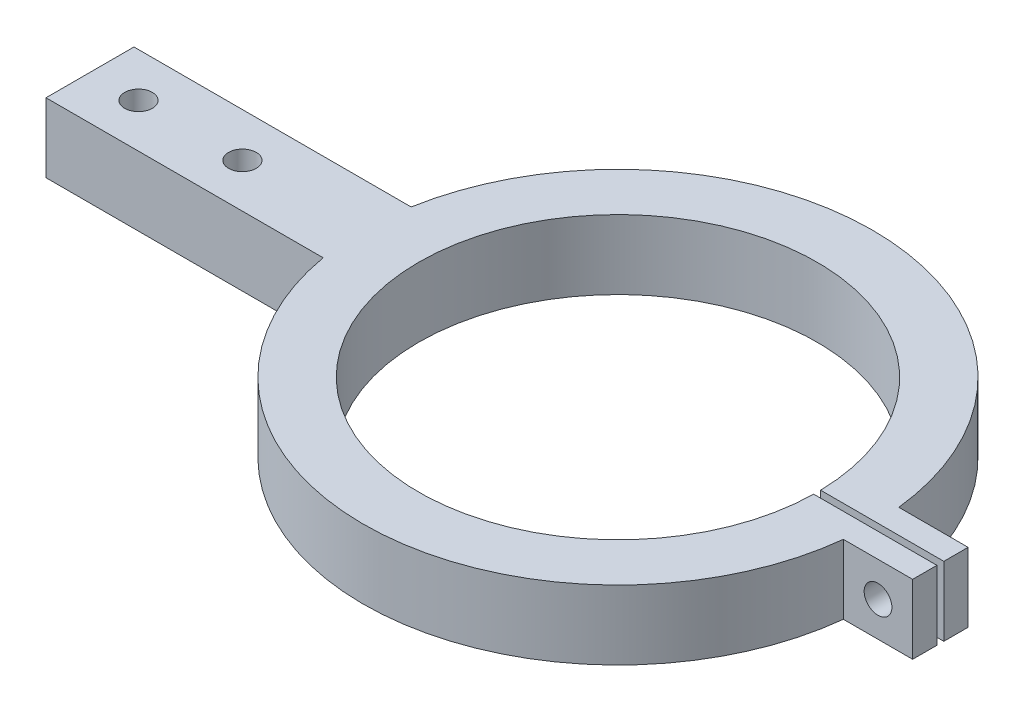
ISO-10303-21;
HEADER;
FILE_DESCRIPTION(('STEP AP214'),'2;1');
FILE_NAME('part.step','',(''),(''),'','','');
FILE_SCHEMA(('AUTOMOTIVE_DESIGN { 1 0 10303 214 1 1 1 1 }'));
ENDSEC;
DATA;
#1=APPLICATION_CONTEXT('core data for automotive mechanical design processes');
#2=APPLICATION_PROTOCOL_DEFINITION('international standard','automotive_design',2000,#1);
#3=PRODUCT_CONTEXT('',#1,'mechanical');
#4=PRODUCT('Part','Part','',(#3));
#5=PRODUCT_RELATED_PRODUCT_CATEGORY('part','',(#4));
#6=PRODUCT_DEFINITION_FORMATION('','',#4);
#7=PRODUCT_DEFINITION_CONTEXT('part definition',#1,'design');
#8=PRODUCT_DEFINITION('design','',#6,#7);
#9=PRODUCT_DEFINITION_SHAPE('','',#8);
#10=(LENGTH_UNIT() NAMED_UNIT(*) SI_UNIT(.MILLI.,.METRE.));
#11=(NAMED_UNIT(*) PLANE_ANGLE_UNIT() SI_UNIT($,.RADIAN.));
#12=(NAMED_UNIT(*) SI_UNIT($,.STERADIAN.) SOLID_ANGLE_UNIT());
#13=UNCERTAINTY_MEASURE_WITH_UNIT(LENGTH_MEASURE(1.E-05),#10,'distance_accuracy_value','');
#14=(GEOMETRIC_REPRESENTATION_CONTEXT(3) GLOBAL_UNCERTAINTY_ASSIGNED_CONTEXT((#13)) GLOBAL_UNIT_ASSIGNED_CONTEXT((#10,
#11,#12)) REPRESENTATION_CONTEXT('',''));
#15=CARTESIAN_POINT('',(0.,0.,0.));
#16=DIRECTION('',(0.,0.,1.));
#17=DIRECTION('',(1.,0.,0.));
#18=AXIS2_PLACEMENT_3D('',#15,#16,#17);
#19=CARTESIAN_POINT('',(0.,10.,0.));
#20=DIRECTION('',(0.,1.,0.));
#21=DIRECTION('',(0.,0.,1.));
#22=AXIS2_PLACEMENT_3D('',#19,#20,#21);
#23=PLANE('',#22);
#24=CARTESIAN_POINT('',(-69.1972374636518,10.,0.));
#25=DIRECTION('',(0.,1.,0.));
#26=DIRECTION('',(0.,0.,1.));
#27=AXIS2_PLACEMENT_3D('',#24,#25,#26);
#28=CIRCLE('',#27,2.);
#29=CARTESIAN_POINT('',(-69.1972374636518,10.,2.));
#30=VERTEX_POINT('',#29);
#31=EDGE_CURVE('E237',#30,#30,#28,.T.);
#32=ORIENTED_EDGE('',*,*,#31,.F.);
#33=EDGE_LOOP('',(#32));
#34=FACE_BOUND('',#33,.T.);
#35=DIRECTION('',(-1.,0.,0.));
#36=VECTOR('',#35,1.);
#37=CARTESIAN_POINT('',(46.5316643475219,10.,-4.));
#38=LINE('',#37,#36);
#39=CARTESIAN_POINT('',(46.5316643475219,10.,-4.));
#40=VERTEX_POINT('',#39);
#41=CARTESIAN_POINT('',(36.5316643475219,10.,-4.));
#42=VERTEX_POINT('',#41);
#43=EDGE_CURVE('E263',#40,#42,#38,.T.);
#44=ORIENTED_EDGE('',*,*,#43,.T.);
#45=CARTESIAN_POINT('',(0.,10.,0.));
#46=DIRECTION('',(0.,1.,0.));
#47=DIRECTION('',(0.,0.,1.));
#48=AXIS2_PLACEMENT_3D('',#45,#46,#47);
#49=CIRCLE('',#48,36.75);
#50=CARTESIAN_POINT('',(-36.1972374636518,10.,-6.34999999999999));
#51=VERTEX_POINT('',#50);
#52=EDGE_CURVE('E182',#42,#51,#49,.T.);
#53=ORIENTED_EDGE('',*,*,#52,.T.);
#54=DIRECTION('',(1.,0.,0.));
#55=VECTOR('',#54,1.);
#56=CARTESIAN_POINT('',(-76.1972374636518,10.,-6.34999999999999));
#57=LINE('',#56,#55);
#58=CARTESIAN_POINT('',(-76.1972374636518,10.,-6.34999999999999));
#59=VERTEX_POINT('',#58);
#60=EDGE_CURVE('E285',#59,#51,#57,.T.);
#61=ORIENTED_EDGE('',*,*,#60,.F.);
#62=DIRECTION('',(0.,0.,-1.));
#63=VECTOR('',#62,1.);
#64=CARTESIAN_POINT('',(-76.1972374636518,10.,6.35000000000001));
#65=LINE('',#64,#63);
#66=CARTESIAN_POINT('',(-76.1972374636518,10.,6.35000000000001));
#67=VERTEX_POINT('',#66);
#68=EDGE_CURVE('E300',#67,#59,#65,.T.);
#69=ORIENTED_EDGE('',*,*,#68,.F.);
#70=DIRECTION('',(1.,0.,0.));
#71=VECTOR('',#70,1.);
#72=CARTESIAN_POINT('',(-76.1972374636518,10.,6.35000000000001));
#73=LINE('',#72,#71);
#74=CARTESIAN_POINT('',(-36.1972374636518,10.,6.35000000000001));
#75=VERTEX_POINT('',#74);
#76=EDGE_CURVE('E302',#67,#75,#73,.T.);
#77=ORIENTED_EDGE('',*,*,#76,.T.);
#78=CARTESIAN_POINT('',(0.,10.,0.));
#79=DIRECTION('',(0.,1.,0.));
#80=DIRECTION('',(0.,0.,1.));
#81=AXIS2_PLACEMENT_3D('',#78,#79,#80);
#82=CIRCLE('',#81,36.75);
#83=CARTESIAN_POINT('',(36.5316643475219,10.,4.00000000000002));
#84=VERTEX_POINT('',#83);
#85=EDGE_CURVE('E308',#75,#84,#82,.T.);
#86=ORIENTED_EDGE('',*,*,#85,.T.);
#87=DIRECTION('',(-1.,0.,0.));
#88=VECTOR('',#87,1.);
#89=CARTESIAN_POINT('',(46.5316643475219,10.,4.));
#90=LINE('',#89,#88);
#91=CARTESIAN_POINT('',(46.5316643475219,10.,4.));
#92=VERTEX_POINT('',#91);
#93=EDGE_CURVE('E310',#92,#84,#90,.T.);
#94=ORIENTED_EDGE('',*,*,#93,.F.);
#95=DIRECTION('',(0.,0.,-1.));
#96=VECTOR('',#95,1.);
#97=CARTESIAN_POINT('',(46.5316643475219,10.,4.));
#98=LINE('',#97,#96);
#99=CARTESIAN_POINT('',(46.5316643475219,10.,0.5));
#100=VERTEX_POINT('',#99);
#101=EDGE_CURVE('E227',#92,#100,#98,.T.);
#102=ORIENTED_EDGE('',*,*,#101,.T.);
#103=DIRECTION('',(1.,0.,0.));
#104=VECTOR('',#103,1.);
#105=CARTESIAN_POINT('',(28.7456518451052,10.,0.5));
#106=LINE('',#105,#104);
#107=CARTESIAN_POINT('',(28.7456518451052,10.,0.5));
#108=VERTEX_POINT('',#107);
#109=EDGE_CURVE('E225',#108,#100,#106,.T.);
#110=ORIENTED_EDGE('',*,*,#109,.F.);
#111=CARTESIAN_POINT('',(0.,10.,0.));
#112=DIRECTION('',(0.,1.,0.));
#113=DIRECTION('',(0.,0.,1.));
#114=AXIS2_PLACEMENT_3D('',#111,#112,#113);
#115=CIRCLE('',#114,28.75);
#116=CARTESIAN_POINT('',(28.7456518451052,10.,-0.500000000000002));
#117=VERTEX_POINT('',#116);
#118=EDGE_CURVE('E213',#117,#108,#115,.T.);
#119=ORIENTED_EDGE('',*,*,#118,.F.);
#120=DIRECTION('',(1.,0.,0.));
#121=VECTOR('',#120,1.);
#122=CARTESIAN_POINT('',(28.7456518451052,10.,-0.5));
#123=LINE('',#122,#121);
#124=CARTESIAN_POINT('',(46.5316643475219,10.,-0.5));
#125=VERTEX_POINT('',#124);
#126=EDGE_CURVE('E219',#117,#125,#123,.T.);
#127=ORIENTED_EDGE('',*,*,#126,.T.);
#128=DIRECTION('',(0.,0.,-1.));
#129=VECTOR('',#128,1.);
#130=CARTESIAN_POINT('',(46.5316643475219,10.,-0.5));
#131=LINE('',#130,#129);
#132=EDGE_CURVE('E128',#125,#40,#131,.T.);
#133=ORIENTED_EDGE('',*,*,#132,.T.);
#134=EDGE_LOOP('',(#44,#53,#61,#69,#77,#86,#94,#102,#110,#119,#127,#133));
#135=FACE_BOUND('',#134,.T.);
#136=CARTESIAN_POINT('',(-54.1972374636518,10.,0.));
#137=DIRECTION('',(0.,1.,0.));
#138=DIRECTION('',(0.,0.,1.));
#139=AXIS2_PLACEMENT_3D('',#136,#137,#138);
#140=CIRCLE('',#139,2.);
#141=CARTESIAN_POINT('',(-54.1972374636518,10.,2.00000000000001));
#142=VERTEX_POINT('',#141);
#143=EDGE_CURVE('E372',#142,#142,#140,.T.);
#144=ORIENTED_EDGE('',*,*,#143,.F.);
#145=EDGE_LOOP('',(#144));
#146=FACE_BOUND('',#145,.T.);
#147=ADVANCED_FACE('F110',(#34,#135,#146),#23,.T.);
#148=CARTESIAN_POINT('',(0.,0.,0.));
#149=DIRECTION('',(0.,1.,0.));
#150=DIRECTION('',(0.,0.,1.));
#151=AXIS2_PLACEMENT_3D('',#148,#149,#150);
#152=PLANE('',#151);
#153=DIRECTION('',(-1.,0.,0.));
#154=VECTOR('',#153,1.);
#155=CARTESIAN_POINT('',(46.5316643475219,0.,-4.));
#156=LINE('',#155,#154);
#157=CARTESIAN_POINT('',(46.5316643475219,0.,-4.));
#158=VERTEX_POINT('',#157);
#159=CARTESIAN_POINT('',(36.5316643475219,0.,-4.));
#160=VERTEX_POINT('',#159);
#161=EDGE_CURVE('E233',#158,#160,#156,.T.);
#162=ORIENTED_EDGE('',*,*,#161,.F.);
#163=DIRECTION('',(0.,0.,-1.));
#164=VECTOR('',#163,1.);
#165=CARTESIAN_POINT('',(46.5316643475219,0.,-0.5));
#166=LINE('',#165,#164);
#167=CARTESIAN_POINT('',(46.5316643475219,0.,-0.5));
#168=VERTEX_POINT('',#167);
#169=EDGE_CURVE('E174',#168,#158,#166,.T.);
#170=ORIENTED_EDGE('',*,*,#169,.F.);
#171=DIRECTION('',(1.,0.,0.));
#172=VECTOR('',#171,1.);
#173=CARTESIAN_POINT('',(28.7456518451052,0.,-0.5));
#174=LINE('',#173,#172);
#175=CARTESIAN_POINT('',(28.7456518451052,0.,-0.500000000000002));
#176=VERTEX_POINT('',#175);
#177=EDGE_CURVE('E168',#176,#168,#174,.T.);
#178=ORIENTED_EDGE('',*,*,#177,.F.);
#179=CARTESIAN_POINT('',(0.,0.,0.));
#180=DIRECTION('',(0.,1.,0.));
#181=DIRECTION('',(0.,0.,1.));
#182=AXIS2_PLACEMENT_3D('',#179,#180,#181);
#183=CIRCLE('',#182,28.75);
#184=CARTESIAN_POINT('',(28.7456518451052,0.,0.5));
#185=VERTEX_POINT('',#184);
#186=EDGE_CURVE('E215',#176,#185,#183,.T.);
#187=ORIENTED_EDGE('',*,*,#186,.T.);
#188=DIRECTION('',(1.,0.,0.));
#189=VECTOR('',#188,1.);
#190=CARTESIAN_POINT('',(28.7456518451052,0.,0.5));
#191=LINE('',#190,#189);
#192=CARTESIAN_POINT('',(46.5316643475219,0.,0.5));
#193=VERTEX_POINT('',#192);
#194=EDGE_CURVE('E257',#185,#193,#191,.T.);
#195=ORIENTED_EDGE('',*,*,#194,.T.);
#196=DIRECTION('',(0.,0.,-1.));
#197=VECTOR('',#196,1.);
#198=CARTESIAN_POINT('',(46.5316643475219,0.,4.));
#199=LINE('',#198,#197);
#200=CARTESIAN_POINT('',(46.5316643475219,0.,4.));
#201=VERTEX_POINT('',#200);
#202=EDGE_CURVE('E254',#201,#193,#199,.T.);
#203=ORIENTED_EDGE('',*,*,#202,.F.);
#204=DIRECTION('',(-1.,0.,0.));
#205=VECTOR('',#204,1.);
#206=CARTESIAN_POINT('',(46.5316643475219,0.,4.));
#207=LINE('',#206,#205);
#208=CARTESIAN_POINT('',(36.5316643475219,0.,4.00000000000002));
#209=VERTEX_POINT('',#208);
#210=EDGE_CURVE('E251',#201,#209,#207,.T.);
#211=ORIENTED_EDGE('',*,*,#210,.T.);
#212=CARTESIAN_POINT('',(0.,0.,0.));
#213=DIRECTION('',(0.,1.,0.));
#214=DIRECTION('',(0.,0.,1.));
#215=AXIS2_PLACEMENT_3D('',#212,#213,#214);
#216=CIRCLE('',#215,36.75);
#217=CARTESIAN_POINT('',(-36.1972374636518,0.,6.35000000000001));
#218=VERTEX_POINT('',#217);
#219=EDGE_CURVE('E248',#218,#209,#216,.T.);
#220=ORIENTED_EDGE('',*,*,#219,.F.);
#221=DIRECTION('',(1.,0.,0.));
#222=VECTOR('',#221,1.);
#223=CARTESIAN_POINT('',(-76.1972374636518,0.,6.35000000000001));
#224=LINE('',#223,#222);
#225=CARTESIAN_POINT('',(-76.1972374636518,0.,6.35000000000001));
#226=VERTEX_POINT('',#225);
#227=EDGE_CURVE('E246',#226,#218,#224,.T.);
#228=ORIENTED_EDGE('',*,*,#227,.F.);
#229=DIRECTION('',(0.,0.,-1.));
#230=VECTOR('',#229,1.);
#231=CARTESIAN_POINT('',(-76.1972374636518,0.,6.35000000000001));
#232=LINE('',#231,#230);
#233=CARTESIAN_POINT('',(-76.1972374636518,0.,-6.34999999999999));
#234=VERTEX_POINT('',#233);
#235=EDGE_CURVE('E243',#226,#234,#232,.T.);
#236=ORIENTED_EDGE('',*,*,#235,.T.);
#237=DIRECTION('',(1.,0.,0.));
#238=VECTOR('',#237,1.);
#239=CARTESIAN_POINT('',(-76.1972374636518,0.,-6.34999999999999));
#240=LINE('',#239,#238);
#241=CARTESIAN_POINT('',(-36.1972374636518,0.,-6.34999999999999));
#242=VERTEX_POINT('',#241);
#243=EDGE_CURVE('E240',#234,#242,#240,.T.);
#244=ORIENTED_EDGE('',*,*,#243,.T.);
#245=CARTESIAN_POINT('',(0.,0.,0.));
#246=DIRECTION('',(0.,1.,0.));
#247=DIRECTION('',(0.,0.,1.));
#248=AXIS2_PLACEMENT_3D('',#245,#246,#247);
#249=CIRCLE('',#248,36.75);
#250=EDGE_CURVE('E236',#160,#242,#249,.T.);
#251=ORIENTED_EDGE('',*,*,#250,.F.);
#252=EDGE_LOOP('',(#162,#170,#178,#187,#195,#203,#211,#220,#228,#236,#244,#251));
#253=FACE_BOUND('',#252,.T.);
#254=CARTESIAN_POINT('',(-69.1972374636518,0.,0.));
#255=DIRECTION('',(0.,1.,0.));
#256=DIRECTION('',(0.,0.,1.));
#257=AXIS2_PLACEMENT_3D('',#254,#255,#256);
#258=CIRCLE('',#257,2.);
#259=CARTESIAN_POINT('',(-69.1972374636518,0.,2.));
#260=VERTEX_POINT('',#259);
#261=EDGE_CURVE('E375',#260,#260,#258,.T.);
#262=ORIENTED_EDGE('',*,*,#261,.T.);
#263=EDGE_LOOP('',(#262));
#264=FACE_BOUND('',#263,.T.);
#265=CARTESIAN_POINT('',(-54.1972374636518,0.,0.));
#266=DIRECTION('',(0.,1.,0.));
#267=DIRECTION('',(0.,0.,1.));
#268=AXIS2_PLACEMENT_3D('',#265,#266,#267);
#269=CIRCLE('',#268,2.);
#270=CARTESIAN_POINT('',(-54.1972374636518,0.,2.00000000000001));
#271=VERTEX_POINT('',#270);
#272=EDGE_CURVE('E371',#271,#271,#269,.T.);
#273=ORIENTED_EDGE('',*,*,#272,.T.);
#274=EDGE_LOOP('',(#273));
#275=FACE_BOUND('',#274,.T.);
#276=ADVANCED_FACE('F290',(#253,#264,#275),#152,.F.);
#277=CARTESIAN_POINT('',(46.5316643475219,10.,-4.));
#278=DIRECTION('',(0.,0.,1.));
#279=DIRECTION('',(1.,0.,0.));
#280=AXIS2_PLACEMENT_3D('',#277,#278,#279);
#281=PLANE('',#280);
#282=CARTESIAN_POINT('',(41.5316643475219,5.,-4.));
#283=DIRECTION('',(0.,0.,1.));
#284=DIRECTION('',(1.,0.,0.));
#285=AXIS2_PLACEMENT_3D('',#282,#283,#284);
#286=CIRCLE('',#285,2.);
#287=CARTESIAN_POINT('',(43.5316643475219,5.,-4.));
#288=VERTEX_POINT('',#287);
#289=EDGE_CURVE('E368',#288,#288,#286,.T.);
#290=ORIENTED_EDGE('',*,*,#289,.T.);
#291=EDGE_LOOP('',(#290));
#292=FACE_BOUND('',#291,.T.);
#293=ORIENTED_EDGE('',*,*,#161,.T.);
#294=DIRECTION('',(0.,-1.,0.));
#295=VECTOR('',#294,1.);
#296=CARTESIAN_POINT('',(36.5316643475219,10.,-4.));
#297=LINE('',#296,#295);
#298=EDGE_CURVE('E12',#42,#160,#297,.T.);
#299=ORIENTED_EDGE('',*,*,#298,.F.);
#300=ORIENTED_EDGE('',*,*,#43,.F.);
#301=DIRECTION('',(0.,-1.,0.));
#302=VECTOR('',#301,1.);
#303=CARTESIAN_POINT('',(46.5316643475219,10.,-4.));
#304=LINE('',#303,#302);
#305=EDGE_CURVE('E232',#40,#158,#304,.T.);
#306=ORIENTED_EDGE('',*,*,#305,.T.);
#307=EDGE_LOOP('',(#293,#299,#300,#306));
#308=FACE_BOUND('',#307,.T.);
#309=ADVANCED_FACE('F112',(#292,#308),#281,.F.);
#310=CARTESIAN_POINT('',(0.,10.,0.));
#311=DIRECTION('',(0.,-1.,0.));
#312=DIRECTION('',(0.,0.,-1.));
#313=AXIS2_PLACEMENT_3D('',#310,#311,#312);
#314=CYLINDRICAL_SURFACE('',#313,36.75);
#315=ORIENTED_EDGE('',*,*,#250,.T.);
#316=DIRECTION('',(0.,-1.,0.));
#317=VECTOR('',#316,1.);
#318=CARTESIAN_POINT('',(-36.1972374636518,10.,-6.34999999999999));
#319=LINE('',#318,#317);
#320=EDGE_CURVE('E120',#51,#242,#319,.T.);
#321=ORIENTED_EDGE('',*,*,#320,.F.);
#322=ORIENTED_EDGE('',*,*,#52,.F.);
#323=ORIENTED_EDGE('',*,*,#298,.T.);
#324=EDGE_LOOP('',(#315,#321,#322,#323));
#325=FACE_BOUND('',#324,.T.);
#326=ADVANCED_FACE('F286',(#325),#314,.T.);
#327=CARTESIAN_POINT('',(-76.1972374636518,10.,-6.34999999999999));
#328=DIRECTION('',(0.,0.,-1.));
#329=DIRECTION('',(-1.,0.,0.));
#330=AXIS2_PLACEMENT_3D('',#327,#328,#329);
#331=PLANE('',#330);
#332=ORIENTED_EDGE('',*,*,#243,.F.);
#333=DIRECTION('',(0.,-1.,0.));
#334=VECTOR('',#333,1.);
#335=CARTESIAN_POINT('',(-76.1972374636518,10.,-6.34999999999999));
#336=LINE('',#335,#334);
#337=EDGE_CURVE('E278',#59,#234,#336,.T.);
#338=ORIENTED_EDGE('',*,*,#337,.F.);
#339=ORIENTED_EDGE('',*,*,#60,.T.);
#340=ORIENTED_EDGE('',*,*,#320,.T.);
#341=EDGE_LOOP('',(#332,#338,#339,#340));
#342=FACE_BOUND('',#341,.T.);
#343=ADVANCED_FACE('F283',(#342),#331,.T.);
#344=CARTESIAN_POINT('',(-76.1972374636518,10.,6.35000000000001));
#345=DIRECTION('',(-1.,0.,0.));
#346=DIRECTION('',(0.,0.,1.));
#347=AXIS2_PLACEMENT_3D('',#344,#345,#346);
#348=PLANE('',#347);
#349=ORIENTED_EDGE('',*,*,#235,.F.);
#350=DIRECTION('',(0.,-1.,0.));
#351=VECTOR('',#350,1.);
#352=CARTESIAN_POINT('',(-76.1972374636518,10.,6.35000000000001));
#353=LINE('',#352,#351);
#354=EDGE_CURVE('E276',#67,#226,#353,.T.);
#355=ORIENTED_EDGE('',*,*,#354,.F.);
#356=ORIENTED_EDGE('',*,*,#68,.T.);
#357=ORIENTED_EDGE('',*,*,#337,.T.);
#358=EDGE_LOOP('',(#349,#355,#356,#357));
#359=FACE_BOUND('',#358,.T.);
#360=ADVANCED_FACE('F296',(#359),#348,.T.);
#361=CARTESIAN_POINT('',(-76.1972374636518,10.,6.35000000000001));
#362=DIRECTION('',(0.,0.,-1.));
#363=DIRECTION('',(-1.,0.,0.));
#364=AXIS2_PLACEMENT_3D('',#361,#362,#363);
#365=PLANE('',#364);
#366=ORIENTED_EDGE('',*,*,#227,.T.);
#367=DIRECTION('',(0.,-1.,0.));
#368=VECTOR('',#367,1.);
#369=CARTESIAN_POINT('',(-36.1972374636518,10.,6.35000000000001));
#370=LINE('',#369,#368);
#371=EDGE_CURVE('E273',#75,#218,#370,.T.);
#372=ORIENTED_EDGE('',*,*,#371,.F.);
#373=ORIENTED_EDGE('',*,*,#76,.F.);
#374=ORIENTED_EDGE('',*,*,#354,.T.);
#375=EDGE_LOOP('',(#366,#372,#373,#374));
#376=FACE_BOUND('',#375,.T.);
#377=ADVANCED_FACE('F401',(#376),#365,.F.);
#378=CARTESIAN_POINT('',(0.,10.,0.));
#379=DIRECTION('',(0.,-1.,0.));
#380=DIRECTION('',(0.,0.,-1.));
#381=AXIS2_PLACEMENT_3D('',#378,#379,#380);
#382=CYLINDRICAL_SURFACE('',#381,36.75);
#383=ORIENTED_EDGE('',*,*,#219,.T.);
#384=DIRECTION('',(0.,-1.,0.));
#385=VECTOR('',#384,1.);
#386=CARTESIAN_POINT('',(36.5316643475219,10.,4.00000000000002));
#387=LINE('',#386,#385);
#388=EDGE_CURVE('E271',#84,#209,#387,.T.);
#389=ORIENTED_EDGE('',*,*,#388,.F.);
#390=ORIENTED_EDGE('',*,*,#85,.F.);
#391=ORIENTED_EDGE('',*,*,#371,.T.);
#392=EDGE_LOOP('',(#383,#389,#390,#391));
#393=FACE_BOUND('',#392,.T.);
#394=ADVANCED_FACE('F404',(#393),#382,.T.);
#395=CARTESIAN_POINT('',(46.5316643475219,10.,4.));
#396=DIRECTION('',(0.,0.,1.));
#397=DIRECTION('',(1.,0.,0.));
#398=AXIS2_PLACEMENT_3D('',#395,#396,#397);
#399=PLANE('',#398);
#400=CARTESIAN_POINT('',(41.5316643475219,5.,4.00000000000002));
#401=DIRECTION('',(0.,0.,1.));
#402=DIRECTION('',(1.,0.,0.));
#403=AXIS2_PLACEMENT_3D('',#400,#401,#402);
#404=CIRCLE('',#403,2.);
#405=CARTESIAN_POINT('',(43.5316643475219,5.,4.00000000000002));
#406=VERTEX_POINT('',#405);
#407=EDGE_CURVE('E362',#406,#406,#404,.T.);
#408=ORIENTED_EDGE('',*,*,#407,.F.);
#409=EDGE_LOOP('',(#408));
#410=FACE_BOUND('',#409,.T.);
#411=ORIENTED_EDGE('',*,*,#210,.F.);
#412=DIRECTION('',(0.,-1.,0.));
#413=VECTOR('',#412,1.);
#414=CARTESIAN_POINT('',(46.5316643475219,10.,4.));
#415=LINE('',#414,#413);
#416=EDGE_CURVE('E269',#92,#201,#415,.T.);
#417=ORIENTED_EDGE('',*,*,#416,.F.);
#418=ORIENTED_EDGE('',*,*,#93,.T.);
#419=ORIENTED_EDGE('',*,*,#388,.T.);
#420=EDGE_LOOP('',(#411,#417,#418,#419));
#421=FACE_BOUND('',#420,.T.);
#422=ADVANCED_FACE('F408',(#410,#421),#399,.T.);
#423=CARTESIAN_POINT('',(46.5316643475219,10.,4.));
#424=DIRECTION('',(-1.,0.,0.));
#425=DIRECTION('',(0.,0.,1.));
#426=AXIS2_PLACEMENT_3D('',#423,#424,#425);
#427=PLANE('',#426);
#428=ORIENTED_EDGE('',*,*,#202,.T.);
#429=DIRECTION('',(0.,-1.,0.));
#430=VECTOR('',#429,1.);
#431=CARTESIAN_POINT('',(46.5316643475219,10.,0.5));
#432=LINE('',#431,#430);
#433=EDGE_CURVE('E267',#100,#193,#432,.T.);
#434=ORIENTED_EDGE('',*,*,#433,.F.);
#435=ORIENTED_EDGE('',*,*,#101,.F.);
#436=ORIENTED_EDGE('',*,*,#416,.T.);
#437=EDGE_LOOP('',(#428,#434,#435,#436));
#438=FACE_BOUND('',#437,.T.);
#439=ADVANCED_FACE('F316',(#438),#427,.F.);
#440=CARTESIAN_POINT('',(28.7456518451052,10.,0.5));
#441=DIRECTION('',(0.,0.,-1.));
#442=DIRECTION('',(-1.,0.,0.));
#443=AXIS2_PLACEMENT_3D('',#440,#441,#442);
#444=PLANE('',#443);
#445=CARTESIAN_POINT('',(41.5316643475219,5.,0.5));
#446=DIRECTION('',(0.,0.,-1.));
#447=DIRECTION('',(-1.,0.,0.));
#448=AXIS2_PLACEMENT_3D('',#445,#446,#447);
#449=CIRCLE('',#448,2.);
#450=CARTESIAN_POINT('',(39.5316643475219,5.,0.5));
#451=VERTEX_POINT('',#450);
#452=EDGE_CURVE('E359',#451,#451,#449,.T.);
#453=ORIENTED_EDGE('',*,*,#452,.F.);
#454=EDGE_LOOP('',(#453));
#455=FACE_BOUND('',#454,.T.);
#456=ORIENTED_EDGE('',*,*,#194,.F.);
#457=DIRECTION('',(0.,-1.,0.));
#458=VECTOR('',#457,1.);
#459=CARTESIAN_POINT('',(28.7456518451052,10.,0.5));
#460=LINE('',#459,#458);
#461=EDGE_CURVE('E216',#108,#185,#460,.T.);
#462=ORIENTED_EDGE('',*,*,#461,.F.);
#463=ORIENTED_EDGE('',*,*,#109,.T.);
#464=ORIENTED_EDGE('',*,*,#433,.T.);
#465=EDGE_LOOP('',(#456,#462,#463,#464));
#466=FACE_BOUND('',#465,.T.);
#467=ADVANCED_FACE('F320',(#455,#466),#444,.T.);
#468=CARTESIAN_POINT('',(0.,10.,0.));
#469=DIRECTION('',(0.,-1.,0.));
#470=DIRECTION('',(0.,0.,-1.));
#471=AXIS2_PLACEMENT_3D('',#468,#469,#470);
#472=CYLINDRICAL_SURFACE('',#471,28.75);
#473=ORIENTED_EDGE('',*,*,#186,.F.);
#474=DIRECTION('',(0.,-1.,0.));
#475=VECTOR('',#474,1.);
#476=CARTESIAN_POINT('',(28.7456518451052,10.,-0.500000000000002));
#477=LINE('',#476,#475);
#478=EDGE_CURVE('E209',#117,#176,#477,.T.);
#479=ORIENTED_EDGE('',*,*,#478,.F.);
#480=ORIENTED_EDGE('',*,*,#118,.T.);
#481=ORIENTED_EDGE('',*,*,#461,.T.);
#482=EDGE_LOOP('',(#473,#479,#480,#481));
#483=FACE_BOUND('',#482,.T.);
#484=ADVANCED_FACE('F211',(#483),#472,.F.);
#485=CARTESIAN_POINT('',(28.7456518451052,10.,-0.5));
#486=DIRECTION('',(0.,0.,-1.));
#487=DIRECTION('',(-1.,0.,0.));
#488=AXIS2_PLACEMENT_3D('',#485,#486,#487);
#489=PLANE('',#488);
#490=CARTESIAN_POINT('',(41.5316643475219,5.,-0.5));
#491=DIRECTION('',(0.,0.,-1.));
#492=DIRECTION('',(-1.,0.,0.));
#493=AXIS2_PLACEMENT_3D('',#490,#491,#492);
#494=CIRCLE('',#493,2.);
#495=CARTESIAN_POINT('',(39.5316643475219,5.,-0.5));
#496=VERTEX_POINT('',#495);
#497=EDGE_CURVE('E114',#496,#496,#494,.T.);
#498=ORIENTED_EDGE('',*,*,#497,.T.);
#499=EDGE_LOOP('',(#498));
#500=FACE_BOUND('',#499,.T.);
#501=ORIENTED_EDGE('',*,*,#177,.T.);
#502=DIRECTION('',(0.,-1.,0.));
#503=VECTOR('',#502,1.);
#504=CARTESIAN_POINT('',(46.5316643475219,10.,-0.5));
#505=LINE('',#504,#503);
#506=EDGE_CURVE('E217',#125,#168,#505,.T.);
#507=ORIENTED_EDGE('',*,*,#506,.F.);
#508=ORIENTED_EDGE('',*,*,#126,.F.);
#509=ORIENTED_EDGE('',*,*,#478,.T.);
#510=EDGE_LOOP('',(#501,#507,#508,#509));
#511=FACE_BOUND('',#510,.T.);
#512=ADVANCED_FACE('F220',(#500,#511),#489,.F.);
#513=CARTESIAN_POINT('',(46.5316643475219,10.,-0.5));
#514=DIRECTION('',(-1.,0.,0.));
#515=DIRECTION('',(0.,0.,1.));
#516=AXIS2_PLACEMENT_3D('',#513,#514,#515);
#517=PLANE('',#516);
#518=ORIENTED_EDGE('',*,*,#169,.T.);
#519=ORIENTED_EDGE('',*,*,#305,.F.);
#520=ORIENTED_EDGE('',*,*,#132,.F.);
#521=ORIENTED_EDGE('',*,*,#506,.T.);
#522=EDGE_LOOP('',(#518,#519,#520,#521));
#523=FACE_BOUND('',#522,.T.);
#524=ADVANCED_FACE('F323',(#523),#517,.F.);
#525=CARTESIAN_POINT('',(-69.1972374636518,10.,0.));
#526=DIRECTION('',(0.,-1.,0.));
#527=DIRECTION('',(0.,0.,-1.));
#528=AXIS2_PLACEMENT_3D('',#525,#526,#527);
#529=CYLINDRICAL_SURFACE('',#528,2.);
#530=ORIENTED_EDGE('',*,*,#31,.T.);
#531=EDGE_LOOP('',(#530));
#532=FACE_BOUND('',#531,.T.);
#533=ORIENTED_EDGE('',*,*,#261,.F.);
#534=EDGE_LOOP('',(#533));
#535=FACE_BOUND('',#534,.T.);
#536=ADVANCED_FACE('F325',(#532,#535),#529,.F.);
#537=CARTESIAN_POINT('',(-54.1972374636518,10.,0.));
#538=DIRECTION('',(0.,-1.,0.));
#539=DIRECTION('',(0.,0.,-1.));
#540=AXIS2_PLACEMENT_3D('',#537,#538,#539);
#541=CYLINDRICAL_SURFACE('',#540,2.);
#542=ORIENTED_EDGE('',*,*,#143,.T.);
#543=EDGE_LOOP('',(#542));
#544=FACE_BOUND('',#543,.T.);
#545=ORIENTED_EDGE('',*,*,#272,.F.);
#546=EDGE_LOOP('',(#545));
#547=FACE_BOUND('',#546,.T.);
#548=ADVANCED_FACE('F331',(#544,#547),#541,.F.);
#549=CARTESIAN_POINT('',(41.5316643475219,5.,-36.75));
#550=DIRECTION('',(0.,0.,1.));
#551=DIRECTION('',(1.,0.,0.));
#552=AXIS2_PLACEMENT_3D('',#549,#550,#551);
#553=CYLINDRICAL_SURFACE('',#552,2.);
#554=ORIENTED_EDGE('',*,*,#497,.F.);
#555=EDGE_LOOP('',(#554));
#556=FACE_BOUND('',#555,.T.);
#557=ORIENTED_EDGE('',*,*,#289,.F.);
#558=EDGE_LOOP('',(#557));
#559=FACE_BOUND('',#558,.T.);
#560=ADVANCED_FACE('F347',(#556,#559),#553,.F.);
#561=ORIENTED_EDGE('',*,*,#452,.T.);
#562=EDGE_LOOP('',(#561));
#563=FACE_BOUND('',#562,.T.);
#564=ORIENTED_EDGE('',*,*,#407,.T.);
#565=EDGE_LOOP('',(#564));
#566=FACE_BOUND('',#565,.T.);
#567=ADVANCED_FACE('F349',(#563,#566),#553,.F.);
#568=CLOSED_SHELL('',(#147,#276,#309,#326,#343,#360,#377,#394,#422,#439,#467,#484,#512,#524,
#536,#548,#560,#567));
#569=MANIFOLD_SOLID_BREP('B2',#568);
#570=ADVANCED_BREP_SHAPE_REPRESENTATION('',(#18,#569),#14);
#571=SHAPE_DEFINITION_REPRESENTATION(#9,#570);
ENDSEC;
END-ISO-10303-21;
